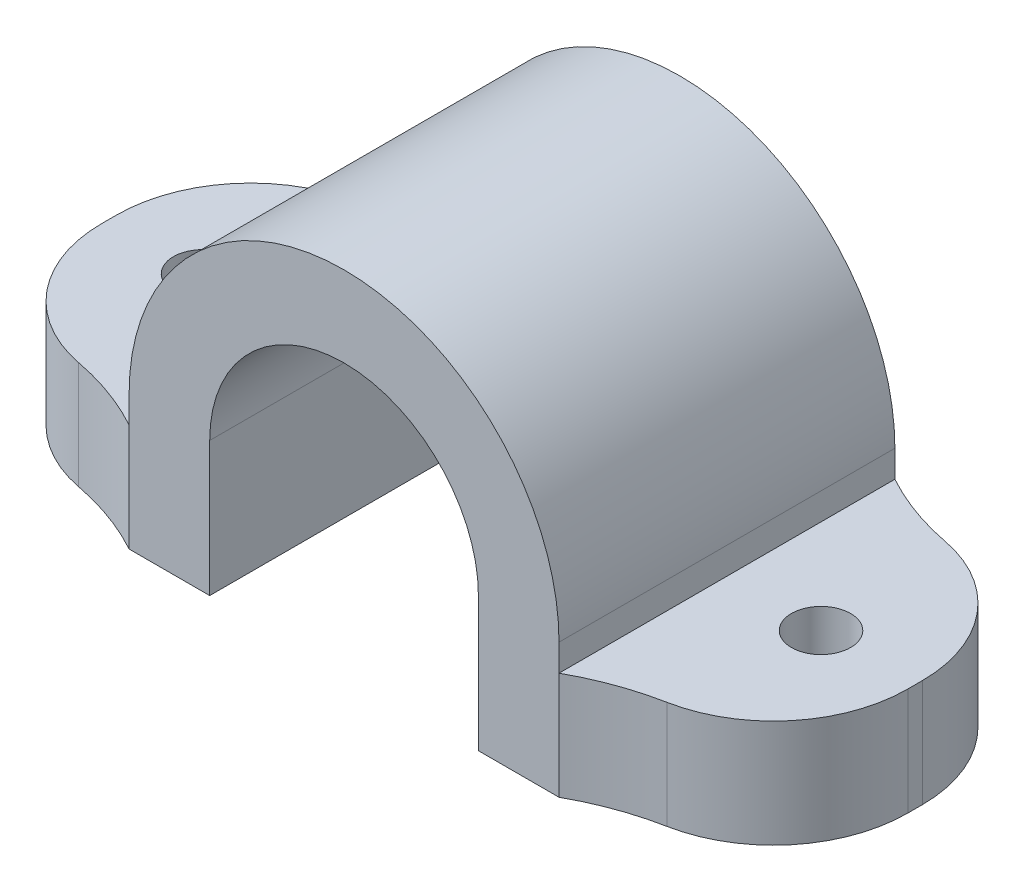
ISO-10303-21;
HEADER;
FILE_DESCRIPTION(('STEP AP214'),'2;1');
FILE_NAME('part.step','',(''),(''),'','','');
FILE_SCHEMA(('AUTOMOTIVE_DESIGN { 1 0 10303 214 1 1 1 1 }'));
ENDSEC;
DATA;
#1=APPLICATION_CONTEXT('core data for automotive mechanical design processes');
#2=APPLICATION_PROTOCOL_DEFINITION('international standard','automotive_design',2000,#1);
#3=PRODUCT_CONTEXT('',#1,'mechanical');
#4=PRODUCT('Part','Part','',(#3));
#5=PRODUCT_RELATED_PRODUCT_CATEGORY('part','',(#4));
#6=PRODUCT_DEFINITION_FORMATION('','',#4);
#7=PRODUCT_DEFINITION_CONTEXT('part definition',#1,'design');
#8=PRODUCT_DEFINITION('design','',#6,#7);
#9=PRODUCT_DEFINITION_SHAPE('','',#8);
#10=(LENGTH_UNIT() NAMED_UNIT(*) SI_UNIT(.MILLI.,.METRE.));
#11=(NAMED_UNIT(*) PLANE_ANGLE_UNIT() SI_UNIT($,.RADIAN.));
#12=(NAMED_UNIT(*) SI_UNIT($,.STERADIAN.) SOLID_ANGLE_UNIT());
#13=UNCERTAINTY_MEASURE_WITH_UNIT(LENGTH_MEASURE(1.E-05),#10,'distance_accuracy_value','');
#14=(GEOMETRIC_REPRESENTATION_CONTEXT(3) GLOBAL_UNCERTAINTY_ASSIGNED_CONTEXT((#13)) GLOBAL_UNIT_ASSIGNED_CONTEXT((#10,
#11,#12)) REPRESENTATION_CONTEXT('',''));
#15=CARTESIAN_POINT('',(0.,0.,0.));
#16=DIRECTION('',(0.,0.,1.));
#17=DIRECTION('',(1.,0.,0.));
#18=AXIS2_PLACEMENT_3D('',#15,#16,#17);
#19=CARTESIAN_POINT('',(-8.,5.,6.25));
#20=DIRECTION('',(1.,0.,0.));
#21=DIRECTION('',(0.,0.,-1.));
#22=AXIS2_PLACEMENT_3D('',#19,#20,#21);
#23=PLANE('',#22);
#24=DIRECTION('',(0.,-1.,0.));
#25=VECTOR('',#24,1.);
#26=CARTESIAN_POINT('',(-8.,5.,-6.25));
#27=LINE('',#26,#25);
#28=CARTESIAN_POINT('',(-8.,5.,-6.25));
#29=VERTEX_POINT('',#28);
#30=CARTESIAN_POINT('',(-8.,4.,-6.25));
#31=VERTEX_POINT('',#30);
#32=EDGE_CURVE('E298',#29,#31,#27,.T.);
#33=ORIENTED_EDGE('',*,*,#32,.T.);
#34=DIRECTION('',(0.,0.,1.));
#35=VECTOR('',#34,1.);
#36=CARTESIAN_POINT('',(-8.,4.,5.));
#37=LINE('',#36,#35);
#38=CARTESIAN_POINT('',(-8.,4.,6.25));
#39=VERTEX_POINT('',#38);
#40=EDGE_CURVE('E330',#31,#39,#37,.T.);
#41=ORIENTED_EDGE('',*,*,#40,.T.);
#42=DIRECTION('',(0.,-1.,0.));
#43=VECTOR('',#42,1.);
#44=CARTESIAN_POINT('',(-8.,5.,6.25));
#45=LINE('',#44,#43);
#46=CARTESIAN_POINT('',(-8.,5.,6.25));
#47=VERTEX_POINT('',#46);
#48=EDGE_CURVE('E278',#47,#39,#45,.T.);
#49=ORIENTED_EDGE('',*,*,#48,.F.);
#50=DIRECTION('',(0.,0.,-1.));
#51=VECTOR('',#50,1.);
#52=CARTESIAN_POINT('',(-8.,5.,6.25));
#53=LINE('',#52,#51);
#54=EDGE_CURVE('E308',#47,#29,#53,.T.);
#55=ORIENTED_EDGE('',*,*,#54,.T.);
#56=EDGE_LOOP('',(#33,#41,#49,#55));
#57=FACE_BOUND('',#56,.T.);
#58=ADVANCED_FACE('F45',(#57),#23,.F.);
#59=CARTESIAN_POINT('',(0.,5.,6.25));
#60=DIRECTION('',(0.,0.,-1.));
#61=DIRECTION('',(-1.,0.,0.));
#62=AXIS2_PLACEMENT_3D('',#59,#60,#61);
#63=CYLINDRICAL_SURFACE('',#62,5.);
#64=CARTESIAN_POINT('',(0.,5.,-6.25));
#65=DIRECTION('',(0.,0.,-1.));
#66=DIRECTION('',(1.,0.,0.));
#67=AXIS2_PLACEMENT_3D('',#64,#65,#66);
#68=CIRCLE('',#67,5.);
#69=CARTESIAN_POINT('',(-5.,5.,-6.25));
#70=VERTEX_POINT('',#69);
#71=CARTESIAN_POINT('',(5.,5.,-6.25));
#72=VERTEX_POINT('',#71);
#73=EDGE_CURVE('E196',#70,#72,#68,.T.);
#74=ORIENTED_EDGE('',*,*,#73,.T.);
#75=DIRECTION('',(0.,0.,-1.));
#76=VECTOR('',#75,1.);
#77=CARTESIAN_POINT('',(5.,5.,6.25));
#78=LINE('',#77,#76);
#79=CARTESIAN_POINT('',(5.,5.,6.25));
#80=VERTEX_POINT('',#79);
#81=EDGE_CURVE('E175',#80,#72,#78,.T.);
#82=ORIENTED_EDGE('',*,*,#81,.F.);
#83=CARTESIAN_POINT('',(0.,5.,6.25));
#84=DIRECTION('',(0.,0.,-1.));
#85=DIRECTION('',(1.,0.,0.));
#86=AXIS2_PLACEMENT_3D('',#83,#84,#85);
#87=CIRCLE('',#86,5.);
#88=CARTESIAN_POINT('',(-5.,5.,6.25));
#89=VERTEX_POINT('',#88);
#90=EDGE_CURVE('E183',#89,#80,#87,.T.);
#91=ORIENTED_EDGE('',*,*,#90,.F.);
#92=DIRECTION('',(0.,0.,-1.));
#93=VECTOR('',#92,1.);
#94=CARTESIAN_POINT('',(-5.,5.,6.25));
#95=LINE('',#94,#93);
#96=EDGE_CURVE('E284',#89,#70,#95,.T.);
#97=ORIENTED_EDGE('',*,*,#96,.T.);
#98=EDGE_LOOP('',(#74,#82,#91,#97));
#99=FACE_BOUND('',#98,.T.);
#100=ADVANCED_FACE('F194',(#99),#63,.F.);
#101=CARTESIAN_POINT('',(5.,5.,6.25));
#102=DIRECTION('',(1.,0.,0.));
#103=DIRECTION('',(0.,1.,0.));
#104=AXIS2_PLACEMENT_3D('',#101,#102,#103);
#105=PLANE('',#104);
#106=DIRECTION('',(0.,-1.,0.));
#107=VECTOR('',#106,1.);
#108=CARTESIAN_POINT('',(5.,5.,-6.25));
#109=LINE('',#108,#107);
#110=CARTESIAN_POINT('',(5.,0.,-6.25));
#111=VERTEX_POINT('',#110);
#112=EDGE_CURVE('E286',#72,#111,#109,.T.);
#113=ORIENTED_EDGE('',*,*,#112,.T.);
#114=DIRECTION('',(0.,0.,-1.));
#115=VECTOR('',#114,1.);
#116=CARTESIAN_POINT('',(5.,0.,6.25));
#117=LINE('',#116,#115);
#118=CARTESIAN_POINT('',(5.,0.,6.25));
#119=VERTEX_POINT('',#118);
#120=EDGE_CURVE('E178',#119,#111,#117,.T.);
#121=ORIENTED_EDGE('',*,*,#120,.F.);
#122=DIRECTION('',(0.,-1.,0.));
#123=VECTOR('',#122,1.);
#124=CARTESIAN_POINT('',(5.,5.,6.25));
#125=LINE('',#124,#123);
#126=EDGE_CURVE('E171',#80,#119,#125,.T.);
#127=ORIENTED_EDGE('',*,*,#126,.F.);
#128=ORIENTED_EDGE('',*,*,#81,.T.);
#129=EDGE_LOOP('',(#113,#121,#127,#128));
#130=FACE_BOUND('',#129,.T.);
#131=ADVANCED_FACE('F173',(#130),#105,.F.);
#132=CARTESIAN_POINT('',(5.,0.,6.25));
#133=DIRECTION('',(0.,1.,0.));
#134=DIRECTION('',(-1.,0.,0.));
#135=AXIS2_PLACEMENT_3D('',#132,#133,#134);
#136=PLANE('',#135);
#137=CARTESIAN_POINT('',(11.5,0.,0.));
#138=DIRECTION('',(0.,-1.,0.));
#139=DIRECTION('',(0.,0.,1.));
#140=AXIS2_PLACEMENT_3D('',#137,#138,#139);
#141=CIRCLE('',#140,1.1);
#142=CARTESIAN_POINT('',(11.5,0.,1.1));
#143=VERTEX_POINT('',#142);
#144=EDGE_CURVE('E602',#143,#143,#141,.T.);
#145=ORIENTED_EDGE('',*,*,#144,.F.);
#146=EDGE_LOOP('',(#145));
#147=FACE_BOUND('',#146,.T.);
#148=DIRECTION('',(0.,0.,-1.));
#149=VECTOR('',#148,1.);
#150=CARTESIAN_POINT('',(15.,0.,5.));
#151=LINE('',#150,#149);
#152=CARTESIAN_POINT('',(15.,0.,0.271543980069155));
#153=VERTEX_POINT('',#152);
#154=CARTESIAN_POINT('',(15.,0.,-0.271543980069155));
#155=VERTEX_POINT('',#154);
#156=EDGE_CURVE('E261',#153,#155,#151,.T.);
#157=ORIENTED_EDGE('',*,*,#156,.F.);
#158=CARTESIAN_POINT('',(10.,0.,0.271543980069155));
#159=DIRECTION('',(0.,1.,0.));
#160=DIRECTION('',(-1.,0.,0.));
#161=AXIS2_PLACEMENT_3D('',#158,#159,#160);
#162=CIRCLE('',#161,5.);
#163=CARTESIAN_POINT('',(10.9470763942531,0.,5.1810293200461));
#164=VERTEX_POINT('',#163);
#165=EDGE_CURVE('E247',#153,#164,#162,.F.);
#166=ORIENTED_EDGE('',*,*,#165,.T.);
#167=CARTESIAN_POINT('',(12.8412291827593,0.,15.));
#168=DIRECTION('',(0.,1.,0.));
#169=DIRECTION('',(-1.,0.,0.));
#170=AXIS2_PLACEMENT_3D('',#167,#168,#169);
#171=CIRCLE('',#170,10.);
#172=CARTESIAN_POINT('',(8.,0.,6.25));
#173=VERTEX_POINT('',#172);
#174=EDGE_CURVE('E230',#164,#173,#171,.T.);
#175=ORIENTED_EDGE('',*,*,#174,.T.);
#176=DIRECTION('',(1.,0.,0.));
#177=VECTOR('',#176,1.);
#178=CARTESIAN_POINT('',(5.,0.,6.25));
#179=LINE('',#178,#177);
#180=EDGE_CURVE('E182',#119,#173,#179,.T.);
#181=ORIENTED_EDGE('',*,*,#180,.F.);
#182=ORIENTED_EDGE('',*,*,#120,.T.);
#183=DIRECTION('',(1.,0.,0.));
#184=VECTOR('',#183,1.);
#185=CARTESIAN_POINT('',(5.,0.,-6.25));
#186=LINE('',#185,#184);
#187=CARTESIAN_POINT('',(8.,0.,-6.25));
#188=VERTEX_POINT('',#187);
#189=EDGE_CURVE('E289',#111,#188,#186,.T.);
#190=ORIENTED_EDGE('',*,*,#189,.T.);
#191=CARTESIAN_POINT('',(12.8412291827593,0.,-15.));
#192=DIRECTION('',(0.,1.,0.));
#193=DIRECTION('',(-1.,0.,0.));
#194=AXIS2_PLACEMENT_3D('',#191,#192,#193);
#195=CIRCLE('',#194,10.);
#196=CARTESIAN_POINT('',(10.9470763942531,0.,-5.1810293200461));
#197=VERTEX_POINT('',#196);
#198=EDGE_CURVE('E236',#188,#197,#195,.T.);
#199=ORIENTED_EDGE('',*,*,#198,.T.);
#200=CARTESIAN_POINT('',(10.,0.,-0.271543980069155));
#201=DIRECTION('',(0.,1.,0.));
#202=DIRECTION('',(-1.,0.,0.));
#203=AXIS2_PLACEMENT_3D('',#200,#201,#202);
#204=CIRCLE('',#203,5.);
#205=EDGE_CURVE('E245',#197,#155,#204,.F.);
#206=ORIENTED_EDGE('',*,*,#205,.T.);
#207=EDGE_LOOP('',(#157,#166,#175,#181,#182,#190,#199,#206));
#208=FACE_BOUND('',#207,.T.);
#209=ADVANCED_FACE('F266',(#147,#208),#136,.F.);
#210=CARTESIAN_POINT('',(8.,5.,6.25));
#211=DIRECTION('',(-1.,0.,0.));
#212=DIRECTION('',(0.,0.,1.));
#213=AXIS2_PLACEMENT_3D('',#210,#211,#212);
#214=PLANE('',#213);
#215=DIRECTION('',(0.,1.,0.));
#216=VECTOR('',#215,1.);
#217=CARTESIAN_POINT('',(8.,5.,6.25));
#218=LINE('',#217,#216);
#219=CARTESIAN_POINT('',(8.,4.,6.25));
#220=VERTEX_POINT('',#219);
#221=CARTESIAN_POINT('',(8.,5.,6.25));
#222=VERTEX_POINT('',#221);
#223=EDGE_CURVE('E272',#220,#222,#218,.T.);
#224=ORIENTED_EDGE('',*,*,#223,.F.);
#225=DIRECTION('',(0.,0.,1.));
#226=VECTOR('',#225,1.);
#227=CARTESIAN_POINT('',(8.,4.,5.));
#228=LINE('',#227,#226);
#229=CARTESIAN_POINT('',(8.,4.,-6.25));
#230=VERTEX_POINT('',#229);
#231=EDGE_CURVE('E262',#230,#220,#228,.T.);
#232=ORIENTED_EDGE('',*,*,#231,.F.);
#233=DIRECTION('',(0.,1.,0.));
#234=VECTOR('',#233,1.);
#235=CARTESIAN_POINT('',(8.,5.,-6.25));
#236=LINE('',#235,#234);
#237=CARTESIAN_POINT('',(8.,5.,-6.25));
#238=VERTEX_POINT('',#237);
#239=EDGE_CURVE('E291',#230,#238,#236,.T.);
#240=ORIENTED_EDGE('',*,*,#239,.T.);
#241=DIRECTION('',(0.,0.,-1.));
#242=VECTOR('',#241,1.);
#243=CARTESIAN_POINT('',(8.,5.,6.25));
#244=LINE('',#243,#242);
#245=EDGE_CURVE('E202',#222,#238,#244,.T.);
#246=ORIENTED_EDGE('',*,*,#245,.F.);
#247=EDGE_LOOP('',(#224,#232,#240,#246));
#248=FACE_BOUND('',#247,.T.);
#249=ADVANCED_FACE('F408',(#248),#214,.F.);
#250=CARTESIAN_POINT('',(0.,5.,6.25));
#251=DIRECTION('',(0.,0.,-1.));
#252=DIRECTION('',(-1.,0.,0.));
#253=AXIS2_PLACEMENT_3D('',#250,#251,#252);
#254=CYLINDRICAL_SURFACE('',#253,8.);
#255=CARTESIAN_POINT('',(0.,5.,-6.25));
#256=DIRECTION('',(0.,0.,1.));
#257=DIRECTION('',(1.,0.,0.));
#258=AXIS2_PLACEMENT_3D('',#255,#256,#257);
#259=CIRCLE('',#258,8.);
#260=EDGE_CURVE('E295',#238,#29,#259,.T.);
#261=ORIENTED_EDGE('',*,*,#260,.T.);
#262=ORIENTED_EDGE('',*,*,#54,.F.);
#263=CARTESIAN_POINT('',(0.,5.,6.25));
#264=DIRECTION('',(0.,0.,1.));
#265=DIRECTION('',(1.,0.,0.));
#266=AXIS2_PLACEMENT_3D('',#263,#264,#265);
#267=CIRCLE('',#266,8.);
#268=EDGE_CURVE('E271',#222,#47,#267,.T.);
#269=ORIENTED_EDGE('',*,*,#268,.F.);
#270=ORIENTED_EDGE('',*,*,#245,.T.);
#271=EDGE_LOOP('',(#261,#262,#269,#270));
#272=FACE_BOUND('',#271,.T.);
#273=ADVANCED_FACE('F315',(#272),#254,.T.);
#274=CARTESIAN_POINT('',(-8.,0.,6.25));
#275=DIRECTION('',(0.,1.,0.));
#276=DIRECTION('',(-1.,0.,0.));
#277=AXIS2_PLACEMENT_3D('',#274,#275,#276);
#278=PLANE('',#277);
#279=CARTESIAN_POINT('',(-11.5,0.,0.));
#280=DIRECTION('',(0.,1.,0.));
#281=DIRECTION('',(0.,0.,1.));
#282=AXIS2_PLACEMENT_3D('',#279,#280,#281);
#283=CIRCLE('',#282,1.1);
#284=CARTESIAN_POINT('',(-11.5,0.,1.1));
#285=VERTEX_POINT('',#284);
#286=EDGE_CURVE('E356',#285,#285,#283,.T.);
#287=ORIENTED_EDGE('',*,*,#286,.T.);
#288=EDGE_LOOP('',(#287));
#289=FACE_BOUND('',#288,.T.);
#290=DIRECTION('',(0.,0.,-1.));
#291=VECTOR('',#290,1.);
#292=CARTESIAN_POINT('',(-15.,0.,5.));
#293=LINE('',#292,#291);
#294=CARTESIAN_POINT('',(-15.,0.,0.271543980069157));
#295=VERTEX_POINT('',#294);
#296=CARTESIAN_POINT('',(-15.,0.,-0.271543980069159));
#297=VERTEX_POINT('',#296);
#298=EDGE_CURVE('E287',#295,#297,#293,.T.);
#299=ORIENTED_EDGE('',*,*,#298,.T.);
#300=CARTESIAN_POINT('',(-10.,0.,-0.271543980069159));
#301=DIRECTION('',(0.,1.,0.));
#302=DIRECTION('',(-1.,0.,0.));
#303=AXIS2_PLACEMENT_3D('',#300,#301,#302);
#304=CIRCLE('',#303,5.);
#305=CARTESIAN_POINT('',(-10.9470763942531,0.,-5.18102932004611));
#306=VERTEX_POINT('',#305);
#307=EDGE_CURVE('E225',#297,#306,#304,.F.);
#308=ORIENTED_EDGE('',*,*,#307,.T.);
#309=CARTESIAN_POINT('',(-12.8412291827593,0.,-15.));
#310=DIRECTION('',(0.,1.,0.));
#311=DIRECTION('',(-1.,0.,0.));
#312=AXIS2_PLACEMENT_3D('',#309,#310,#311);
#313=CIRCLE('',#312,10.);
#314=CARTESIAN_POINT('',(-8.,0.,-6.25));
#315=VERTEX_POINT('',#314);
#316=EDGE_CURVE('E200',#306,#315,#313,.T.);
#317=ORIENTED_EDGE('',*,*,#316,.T.);
#318=DIRECTION('',(1.,0.,0.));
#319=VECTOR('',#318,1.);
#320=CARTESIAN_POINT('',(-8.,0.,-6.25));
#321=LINE('',#320,#319);
#322=CARTESIAN_POINT('',(-5.,0.,-6.25));
#323=VERTEX_POINT('',#322);
#324=EDGE_CURVE('E301',#315,#323,#321,.T.);
#325=ORIENTED_EDGE('',*,*,#324,.T.);
#326=DIRECTION('',(0.,0.,-1.));
#327=VECTOR('',#326,1.);
#328=CARTESIAN_POINT('',(-5.,0.,6.25));
#329=LINE('',#328,#327);
#330=CARTESIAN_POINT('',(-5.,0.,6.25));
#331=VERTEX_POINT('',#330);
#332=EDGE_CURVE('E305',#331,#323,#329,.T.);
#333=ORIENTED_EDGE('',*,*,#332,.F.);
#334=DIRECTION('',(1.,0.,0.));
#335=VECTOR('',#334,1.);
#336=CARTESIAN_POINT('',(-8.,0.,6.25));
#337=LINE('',#336,#335);
#338=CARTESIAN_POINT('',(-8.,0.,6.25));
#339=VERTEX_POINT('',#338);
#340=EDGE_CURVE('E281',#339,#331,#337,.T.);
#341=ORIENTED_EDGE('',*,*,#340,.F.);
#342=CARTESIAN_POINT('',(-12.8412291827593,0.,15.));
#343=DIRECTION('',(0.,1.,0.));
#344=DIRECTION('',(-1.,0.,0.));
#345=AXIS2_PLACEMENT_3D('',#342,#343,#344);
#346=CIRCLE('',#345,10.);
#347=CARTESIAN_POINT('',(-10.9470763942531,0.,5.1810293200461));
#348=VERTEX_POINT('',#347);
#349=EDGE_CURVE('E207',#339,#348,#346,.T.);
#350=ORIENTED_EDGE('',*,*,#349,.T.);
#351=CARTESIAN_POINT('',(-10.,0.,0.271543980069157));
#352=DIRECTION('',(0.,1.,0.));
#353=DIRECTION('',(-1.,0.,0.));
#354=AXIS2_PLACEMENT_3D('',#351,#352,#353);
#355=CIRCLE('',#354,5.);
#356=EDGE_CURVE('E223',#348,#295,#355,.F.);
#357=ORIENTED_EDGE('',*,*,#356,.T.);
#358=EDGE_LOOP('',(#299,#308,#317,#325,#333,#341,#350,#357));
#359=FACE_BOUND('',#358,.T.);
#360=ADVANCED_FACE('F340',(#289,#359),#278,.F.);
#361=CARTESIAN_POINT('',(-5.,5.,6.25));
#362=DIRECTION('',(-1.,0.,0.));
#363=DIRECTION('',(0.,-1.,0.));
#364=AXIS2_PLACEMENT_3D('',#361,#362,#363);
#365=PLANE('',#364);
#366=DIRECTION('',(0.,1.,0.));
#367=VECTOR('',#366,1.);
#368=CARTESIAN_POINT('',(-5.,5.,-6.25));
#369=LINE('',#368,#367);
#370=EDGE_CURVE('E192',#323,#70,#369,.T.);
#371=ORIENTED_EDGE('',*,*,#370,.T.);
#372=ORIENTED_EDGE('',*,*,#96,.F.);
#373=DIRECTION('',(0.,1.,0.));
#374=VECTOR('',#373,1.);
#375=CARTESIAN_POINT('',(-5.,5.,6.25));
#376=LINE('',#375,#374);
#377=EDGE_CURVE('E188',#331,#89,#376,.T.);
#378=ORIENTED_EDGE('',*,*,#377,.F.);
#379=ORIENTED_EDGE('',*,*,#332,.T.);
#380=EDGE_LOOP('',(#371,#372,#378,#379));
#381=FACE_BOUND('',#380,.T.);
#382=ADVANCED_FACE('F345',(#381),#365,.F.);
#383=CARTESIAN_POINT('',(0.,5.,6.25));
#384=DIRECTION('',(0.,0.,1.));
#385=DIRECTION('',(1.,0.,0.));
#386=AXIS2_PLACEMENT_3D('',#383,#384,#385);
#387=PLANE('',#386);
#388=ORIENTED_EDGE('',*,*,#90,.T.);
#389=ORIENTED_EDGE('',*,*,#126,.T.);
#390=ORIENTED_EDGE('',*,*,#180,.T.);
#391=EDGE_CURVE('E270',#173,#220,#218,.T.);
#392=ORIENTED_EDGE('',*,*,#391,.T.);
#393=ORIENTED_EDGE('',*,*,#223,.T.);
#394=ORIENTED_EDGE('',*,*,#268,.T.);
#395=ORIENTED_EDGE('',*,*,#48,.T.);
#396=EDGE_CURVE('E274',#39,#339,#45,.T.);
#397=ORIENTED_EDGE('',*,*,#396,.T.);
#398=ORIENTED_EDGE('',*,*,#340,.T.);
#399=ORIENTED_EDGE('',*,*,#377,.T.);
#400=EDGE_LOOP('',(#388,#389,#390,#392,#393,#394,#395,#397,#398,#399));
#401=FACE_BOUND('',#400,.T.);
#402=ADVANCED_FACE('F186',(#401),#387,.T.);
#403=CARTESIAN_POINT('',(0.,5.,-6.25));
#404=DIRECTION('',(0.,0.,1.));
#405=DIRECTION('',(1.,0.,0.));
#406=AXIS2_PLACEMENT_3D('',#403,#404,#405);
#407=PLANE('',#406);
#408=ORIENTED_EDGE('',*,*,#73,.F.);
#409=ORIENTED_EDGE('',*,*,#370,.F.);
#410=ORIENTED_EDGE('',*,*,#324,.F.);
#411=EDGE_CURVE('E297',#31,#315,#27,.T.);
#412=ORIENTED_EDGE('',*,*,#411,.F.);
#413=ORIENTED_EDGE('',*,*,#32,.F.);
#414=ORIENTED_EDGE('',*,*,#260,.F.);
#415=ORIENTED_EDGE('',*,*,#239,.F.);
#416=EDGE_CURVE('E292',#188,#230,#236,.T.);
#417=ORIENTED_EDGE('',*,*,#416,.F.);
#418=ORIENTED_EDGE('',*,*,#189,.F.);
#419=ORIENTED_EDGE('',*,*,#112,.F.);
#420=EDGE_LOOP('',(#408,#409,#410,#412,#413,#414,#415,#417,#418,#419));
#421=FACE_BOUND('',#420,.T.);
#422=ADVANCED_FACE('F322',(#421),#407,.F.);
#423=CARTESIAN_POINT('',(-15.,0.,0.));
#424=DIRECTION('',(1.,0.,0.));
#425=DIRECTION('',(0.,0.,-1.));
#426=AXIS2_PLACEMENT_3D('',#423,#424,#425);
#427=PLANE('',#426);
#428=DIRECTION('',(0.,0.,1.));
#429=VECTOR('',#428,1.);
#430=CARTESIAN_POINT('',(-15.,4.,5.));
#431=LINE('',#430,#429);
#432=CARTESIAN_POINT('',(-15.,4.,-0.271543980069159));
#433=VERTEX_POINT('',#432);
#434=CARTESIAN_POINT('',(-15.,4.,0.271543980069157));
#435=VERTEX_POINT('',#434);
#436=EDGE_CURVE('E362',#433,#435,#431,.T.);
#437=ORIENTED_EDGE('',*,*,#436,.F.);
#438=DIRECTION('',(0.,-1.,0.));
#439=VECTOR('',#438,1.);
#440=CARTESIAN_POINT('',(-15.,0.,-0.271543980069159));
#441=LINE('',#440,#439);
#442=EDGE_CURVE('E221',#433,#297,#441,.T.);
#443=ORIENTED_EDGE('',*,*,#442,.T.);
#444=ORIENTED_EDGE('',*,*,#298,.F.);
#445=DIRECTION('',(0.,-1.,0.));
#446=VECTOR('',#445,1.);
#447=CARTESIAN_POINT('',(-15.,0.,0.271543980069157));
#448=LINE('',#447,#446);
#449=EDGE_CURVE('E219',#295,#435,#448,.F.);
#450=ORIENTED_EDGE('',*,*,#449,.T.);
#451=EDGE_LOOP('',(#437,#443,#444,#450));
#452=FACE_BOUND('',#451,.T.);
#453=ADVANCED_FACE('F383',(#452),#427,.F.);
#454=CARTESIAN_POINT('',(8.002,4.,5.));
#455=DIRECTION('',(0.,-1.,0.));
#456=DIRECTION('',(0.,0.,-1.));
#457=AXIS2_PLACEMENT_3D('',#454,#455,#456);
#458=PLANE('',#457);
#459=CARTESIAN_POINT('',(-11.5,4.,0.));
#460=DIRECTION('',(0.,1.,0.));
#461=DIRECTION('',(0.,0.,1.));
#462=AXIS2_PLACEMENT_3D('',#459,#460,#461);
#463=CIRCLE('',#462,1.1);
#464=CARTESIAN_POINT('',(-11.5,4.,1.1));
#465=VERTEX_POINT('',#464);
#466=EDGE_CURVE('E353',#465,#465,#463,.T.);
#467=ORIENTED_EDGE('',*,*,#466,.F.);
#468=EDGE_LOOP('',(#467));
#469=FACE_BOUND('',#468,.T.);
#470=CARTESIAN_POINT('',(-12.8412291827593,4.,-15.));
#471=DIRECTION('',(0.,-1.,0.));
#472=DIRECTION('',(0.,0.,-1.));
#473=AXIS2_PLACEMENT_3D('',#470,#471,#472);
#474=CIRCLE('',#473,10.);
#475=CARTESIAN_POINT('',(-10.9470763942531,4.,-5.18102932004611));
#476=VERTEX_POINT('',#475);
#477=EDGE_CURVE('E197',#31,#476,#474,.T.);
#478=ORIENTED_EDGE('',*,*,#477,.T.);
#479=CARTESIAN_POINT('',(-10.,4.,-0.271543980069159));
#480=DIRECTION('',(0.,-1.,0.));
#481=DIRECTION('',(0.,0.,-1.));
#482=AXIS2_PLACEMENT_3D('',#479,#480,#481);
#483=CIRCLE('',#482,5.);
#484=EDGE_CURVE('E217',#476,#433,#483,.F.);
#485=ORIENTED_EDGE('',*,*,#484,.T.);
#486=ORIENTED_EDGE('',*,*,#436,.T.);
#487=CARTESIAN_POINT('',(-10.,4.,0.271543980069157));
#488=DIRECTION('',(0.,-1.,0.));
#489=DIRECTION('',(0.,0.,-1.));
#490=AXIS2_PLACEMENT_3D('',#487,#488,#489);
#491=CIRCLE('',#490,5.);
#492=CARTESIAN_POINT('',(-10.9470763942531,4.,5.1810293200461));
#493=VERTEX_POINT('',#492);
#494=EDGE_CURVE('E215',#435,#493,#491,.F.);
#495=ORIENTED_EDGE('',*,*,#494,.T.);
#496=CARTESIAN_POINT('',(-12.8412291827593,4.,15.));
#497=DIRECTION('',(0.,-1.,0.));
#498=DIRECTION('',(0.,0.,-1.));
#499=AXIS2_PLACEMENT_3D('',#496,#497,#498);
#500=CIRCLE('',#499,10.);
#501=EDGE_CURVE('E210',#493,#39,#500,.T.);
#502=ORIENTED_EDGE('',*,*,#501,.T.);
#503=ORIENTED_EDGE('',*,*,#40,.F.);
#504=EDGE_LOOP('',(#478,#485,#486,#495,#502,#503));
#505=FACE_BOUND('',#504,.T.);
#506=ADVANCED_FACE('F378',(#469,#505),#458,.F.);
#507=CARTESIAN_POINT('',(-12.8412291827593,5.,-15.));
#508=DIRECTION('',(0.,-1.,0.));
#509=DIRECTION('',(0.,0.,-1.));
#510=AXIS2_PLACEMENT_3D('',#507,#508,#509);
#511=CYLINDRICAL_SURFACE('',#510,10.);
#512=ORIENTED_EDGE('',*,*,#316,.F.);
#513=DIRECTION('',(0.,-1.,0.));
#514=VECTOR('',#513,1.);
#515=CARTESIAN_POINT('',(-10.9470763942531,5.,-5.18102932004611));
#516=LINE('',#515,#514);
#517=EDGE_CURVE('E212',#306,#476,#516,.F.);
#518=ORIENTED_EDGE('',*,*,#517,.T.);
#519=ORIENTED_EDGE('',*,*,#477,.F.);
#520=ORIENTED_EDGE('',*,*,#411,.T.);
#521=EDGE_LOOP('',(#512,#518,#519,#520));
#522=FACE_BOUND('',#521,.T.);
#523=ADVANCED_FACE('F376',(#522),#511,.F.);
#524=CARTESIAN_POINT('',(-12.8412291827593,5.00000000000001,15.));
#525=DIRECTION('',(0.,-1.,0.));
#526=DIRECTION('',(0.,0.,-1.));
#527=AXIS2_PLACEMENT_3D('',#524,#525,#526);
#528=CYLINDRICAL_SURFACE('',#527,10.);
#529=ORIENTED_EDGE('',*,*,#501,.F.);
#530=DIRECTION('',(0.,-1.,0.));
#531=VECTOR('',#530,1.);
#532=CARTESIAN_POINT('',(-10.9470763942531,5.00000000000001,5.1810293200461));
#533=LINE('',#532,#531);
#534=EDGE_CURVE('E227',#493,#348,#533,.T.);
#535=ORIENTED_EDGE('',*,*,#534,.T.);
#536=ORIENTED_EDGE('',*,*,#349,.F.);
#537=ORIENTED_EDGE('',*,*,#396,.F.);
#538=EDGE_LOOP('',(#529,#535,#536,#537));
#539=FACE_BOUND('',#538,.T.);
#540=ADVANCED_FACE('F336',(#539),#528,.F.);
#541=CARTESIAN_POINT('',(-10.,5.,-0.271543980069159));
#542=DIRECTION('',(0.,-1.,0.));
#543=DIRECTION('',(0.,0.,-1.));
#544=AXIS2_PLACEMENT_3D('',#541,#542,#543);
#545=CYLINDRICAL_SURFACE('',#544,5.);
#546=ORIENTED_EDGE('',*,*,#307,.F.);
#547=ORIENTED_EDGE('',*,*,#442,.F.);
#548=ORIENTED_EDGE('',*,*,#484,.F.);
#549=ORIENTED_EDGE('',*,*,#517,.F.);
#550=EDGE_LOOP('',(#546,#547,#548,#549));
#551=FACE_BOUND('',#550,.T.);
#552=ADVANCED_FACE('F373',(#551),#545,.T.);
#553=CARTESIAN_POINT('',(-10.,5.00000000000001,0.271543980069157));
#554=DIRECTION('',(0.,-1.,0.));
#555=DIRECTION('',(0.,0.,-1.));
#556=AXIS2_PLACEMENT_3D('',#553,#554,#555);
#557=CYLINDRICAL_SURFACE('',#556,5.);
#558=ORIENTED_EDGE('',*,*,#494,.F.);
#559=ORIENTED_EDGE('',*,*,#449,.F.);
#560=ORIENTED_EDGE('',*,*,#356,.F.);
#561=ORIENTED_EDGE('',*,*,#534,.F.);
#562=EDGE_LOOP('',(#558,#559,#560,#561));
#563=FACE_BOUND('',#562,.T.);
#564=ADVANCED_FACE('F382',(#563),#557,.T.);
#565=CARTESIAN_POINT('',(-11.5,0.,0.));
#566=DIRECTION('',(0.,1.,0.));
#567=DIRECTION('',(0.,0.,1.));
#568=AXIS2_PLACEMENT_3D('',#565,#566,#567);
#569=CYLINDRICAL_SURFACE('',#568,1.1);
#570=ORIENTED_EDGE('',*,*,#286,.F.);
#571=EDGE_LOOP('',(#570));
#572=FACE_BOUND('',#571,.T.);
#573=ORIENTED_EDGE('',*,*,#466,.T.);
#574=EDGE_LOOP('',(#573));
#575=FACE_BOUND('',#574,.T.);
#576=ADVANCED_FACE('F422',(#572,#575),#569,.F.);
#577=CARTESIAN_POINT('',(-15.002,4.,5.));
#578=DIRECTION('',(0.,1.,0.));
#579=DIRECTION('',(0.,0.,1.));
#580=AXIS2_PLACEMENT_3D('',#577,#578,#579);
#581=PLANE('',#580);
#582=CARTESIAN_POINT('',(11.5,4.,0.));
#583=DIRECTION('',(0.,-1.,0.));
#584=DIRECTION('',(0.,0.,1.));
#585=AXIS2_PLACEMENT_3D('',#582,#583,#584);
#586=CIRCLE('',#585,1.1);
#587=CARTESIAN_POINT('',(11.5,4.,1.1));
#588=VERTEX_POINT('',#587);
#589=EDGE_CURVE('E600',#588,#588,#586,.T.);
#590=ORIENTED_EDGE('',*,*,#589,.T.);
#591=EDGE_LOOP('',(#590));
#592=FACE_BOUND('',#591,.T.);
#593=CARTESIAN_POINT('',(12.8412291827593,4.,15.));
#594=DIRECTION('',(0.,1.,0.));
#595=DIRECTION('',(0.,0.,1.));
#596=AXIS2_PLACEMENT_3D('',#593,#594,#595);
#597=CIRCLE('',#596,10.);
#598=CARTESIAN_POINT('',(10.9470763942531,4.,5.1810293200461));
#599=VERTEX_POINT('',#598);
#600=EDGE_CURVE('E232',#220,#599,#597,.F.);
#601=ORIENTED_EDGE('',*,*,#600,.T.);
#602=CARTESIAN_POINT('',(10.,4.,0.271543980069155));
#603=DIRECTION('',(0.,1.,0.));
#604=DIRECTION('',(0.,0.,1.));
#605=AXIS2_PLACEMENT_3D('',#602,#603,#604);
#606=CIRCLE('',#605,5.);
#607=CARTESIAN_POINT('',(15.,4.,0.271543980069155));
#608=VERTEX_POINT('',#607);
#609=EDGE_CURVE('E53',#599,#608,#606,.T.);
#610=ORIENTED_EDGE('',*,*,#609,.T.);
#611=DIRECTION('',(0.,0.,1.));
#612=VECTOR('',#611,1.);
#613=CARTESIAN_POINT('',(15.,4.,5.));
#614=LINE('',#613,#612);
#615=CARTESIAN_POINT('',(15.,4.,-0.271543980069155));
#616=VERTEX_POINT('',#615);
#617=EDGE_CURVE('E253',#616,#608,#614,.T.);
#618=ORIENTED_EDGE('',*,*,#617,.F.);
#619=CARTESIAN_POINT('',(10.,4.,-0.271543980069155));
#620=DIRECTION('',(0.,1.,0.));
#621=DIRECTION('',(0.,0.,1.));
#622=AXIS2_PLACEMENT_3D('',#619,#620,#621);
#623=CIRCLE('',#622,5.);
#624=CARTESIAN_POINT('',(10.9470763942531,4.,-5.1810293200461));
#625=VERTEX_POINT('',#624);
#626=EDGE_CURVE('E60',#616,#625,#623,.T.);
#627=ORIENTED_EDGE('',*,*,#626,.T.);
#628=CARTESIAN_POINT('',(12.8412291827593,4.,-15.));
#629=DIRECTION('',(0.,1.,0.));
#630=DIRECTION('',(0.,0.,1.));
#631=AXIS2_PLACEMENT_3D('',#628,#629,#630);
#632=CIRCLE('',#631,10.);
#633=EDGE_CURVE('E234',#625,#230,#632,.F.);
#634=ORIENTED_EDGE('',*,*,#633,.T.);
#635=ORIENTED_EDGE('',*,*,#231,.T.);
#636=EDGE_LOOP('',(#601,#610,#618,#627,#634,#635));
#637=FACE_BOUND('',#636,.T.);
#638=ADVANCED_FACE('F252',(#592,#637),#581,.T.);
#639=CARTESIAN_POINT('',(15.,0.,0.));
#640=DIRECTION('',(-1.,0.,0.));
#641=DIRECTION('',(0.,0.,-1.));
#642=AXIS2_PLACEMENT_3D('',#639,#640,#641);
#643=PLANE('',#642);
#644=ORIENTED_EDGE('',*,*,#617,.T.);
#645=DIRECTION('',(0.,1.,0.));
#646=VECTOR('',#645,1.);
#647=CARTESIAN_POINT('',(15.,0.,0.271543980069155));
#648=LINE('',#647,#646);
#649=EDGE_CURVE('E242',#608,#153,#648,.F.);
#650=ORIENTED_EDGE('',*,*,#649,.T.);
#651=ORIENTED_EDGE('',*,*,#156,.T.);
#652=DIRECTION('',(0.,1.,0.));
#653=VECTOR('',#652,1.);
#654=CARTESIAN_POINT('',(15.,0.,-0.271543980069155));
#655=LINE('',#654,#653);
#656=EDGE_CURVE('E239',#155,#616,#655,.T.);
#657=ORIENTED_EDGE('',*,*,#656,.T.);
#658=EDGE_LOOP('',(#644,#650,#651,#657));
#659=FACE_BOUND('',#658,.T.);
#660=ADVANCED_FACE('F257',(#659),#643,.F.);
#661=CARTESIAN_POINT('',(11.5,0.,0.));
#662=DIRECTION('',(0.,1.,0.));
#663=DIRECTION('',(0.,0.,1.));
#664=AXIS2_PLACEMENT_3D('',#661,#662,#663);
#665=CYLINDRICAL_SURFACE('',#664,1.1);
#666=ORIENTED_EDGE('',*,*,#144,.T.);
#667=EDGE_LOOP('',(#666));
#668=FACE_BOUND('',#667,.T.);
#669=ORIENTED_EDGE('',*,*,#589,.F.);
#670=EDGE_LOOP('',(#669));
#671=FACE_BOUND('',#670,.T.);
#672=ADVANCED_FACE('F425',(#668,#671),#665,.F.);
#673=CARTESIAN_POINT('',(12.8412291827593,5.00000000000001,15.));
#674=DIRECTION('',(0.,1.,0.));
#675=DIRECTION('',(0.,0.,1.));
#676=AXIS2_PLACEMENT_3D('',#673,#674,#675);
#677=CYLINDRICAL_SURFACE('',#676,10.);
#678=ORIENTED_EDGE('',*,*,#174,.F.);
#679=DIRECTION('',(0.,1.,0.));
#680=VECTOR('',#679,1.);
#681=CARTESIAN_POINT('',(10.9470763942531,5.00000000000001,5.1810293200461));
#682=LINE('',#681,#680);
#683=EDGE_CURVE('E68',#164,#599,#682,.T.);
#684=ORIENTED_EDGE('',*,*,#683,.T.);
#685=ORIENTED_EDGE('',*,*,#600,.F.);
#686=ORIENTED_EDGE('',*,*,#391,.F.);
#687=EDGE_LOOP('',(#678,#684,#685,#686));
#688=FACE_BOUND('',#687,.T.);
#689=ADVANCED_FACE('F268',(#688),#677,.F.);
#690=CARTESIAN_POINT('',(12.8412291827593,5.,-15.));
#691=DIRECTION('',(0.,1.,0.));
#692=DIRECTION('',(0.,0.,1.));
#693=AXIS2_PLACEMENT_3D('',#690,#691,#692);
#694=CYLINDRICAL_SURFACE('',#693,10.);
#695=ORIENTED_EDGE('',*,*,#633,.F.);
#696=DIRECTION('',(0.,1.,0.));
#697=VECTOR('',#696,1.);
#698=CARTESIAN_POINT('',(10.9470763942531,5.,-5.1810293200461));
#699=LINE('',#698,#697);
#700=EDGE_CURVE('E11',#625,#197,#699,.F.);
#701=ORIENTED_EDGE('',*,*,#700,.T.);
#702=ORIENTED_EDGE('',*,*,#198,.F.);
#703=ORIENTED_EDGE('',*,*,#416,.T.);
#704=EDGE_LOOP('',(#695,#701,#702,#703));
#705=FACE_BOUND('',#704,.T.);
#706=ADVANCED_FACE('F350',(#705),#694,.F.);
#707=CARTESIAN_POINT('',(10.,5.00000000000001,0.271543980069155));
#708=DIRECTION('',(0.,1.,0.));
#709=DIRECTION('',(0.,0.,1.));
#710=AXIS2_PLACEMENT_3D('',#707,#708,#709);
#711=CYLINDRICAL_SURFACE('',#710,5.);
#712=ORIENTED_EDGE('',*,*,#609,.F.);
#713=ORIENTED_EDGE('',*,*,#683,.F.);
#714=ORIENTED_EDGE('',*,*,#165,.F.);
#715=ORIENTED_EDGE('',*,*,#649,.F.);
#716=EDGE_LOOP('',(#712,#713,#714,#715));
#717=FACE_BOUND('',#716,.T.);
#718=ADVANCED_FACE('F264',(#717),#711,.T.);
#719=CARTESIAN_POINT('',(10.,5.,-0.271543980069155));
#720=DIRECTION('',(0.,1.,0.));
#721=DIRECTION('',(0.,0.,1.));
#722=AXIS2_PLACEMENT_3D('',#719,#720,#721);
#723=CYLINDRICAL_SURFACE('',#722,5.);
#724=ORIENTED_EDGE('',*,*,#205,.F.);
#725=ORIENTED_EDGE('',*,*,#700,.F.);
#726=ORIENTED_EDGE('',*,*,#626,.F.);
#727=ORIENTED_EDGE('',*,*,#656,.F.);
#728=EDGE_LOOP('',(#724,#725,#726,#727));
#729=FACE_BOUND('',#728,.T.);
#730=ADVANCED_FACE('F47',(#729),#723,.T.);
#731=CLOSED_SHELL('',(#58,#100,#131,#209,#249,#273,#360,#382,#402,#422,#453,#506,#523,#540,#552,
#564,#576,#638,#660,#672,#689,#706,#718,#730));
#732=MANIFOLD_SOLID_BREP('B2',#731);
#733=ADVANCED_BREP_SHAPE_REPRESENTATION('',(#18,#732),#14);
#734=SHAPE_DEFINITION_REPRESENTATION(#9,#733);
ENDSEC;
END-ISO-10303-21;
